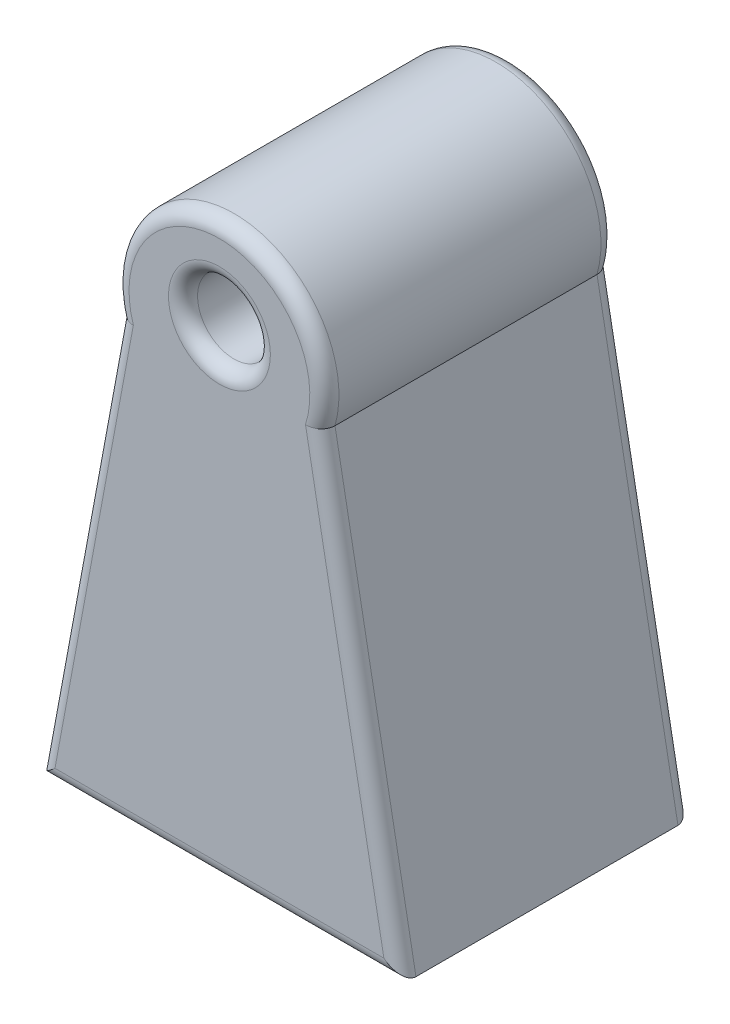
ISO-10303-21;
HEADER;
FILE_DESCRIPTION(('STEP AP214'),'2;1');
FILE_NAME('part.step','',(''),(''),'','','');
FILE_SCHEMA(('AUTOMOTIVE_DESIGN { 1 0 10303 214 1 1 1 1 }'));
ENDSEC;
DATA;
#1=APPLICATION_CONTEXT('core data for automotive mechanical design processes');
#2=APPLICATION_PROTOCOL_DEFINITION('international standard','automotive_design',2000,#1);
#3=PRODUCT_CONTEXT('',#1,'mechanical');
#4=PRODUCT('Part','Part','',(#3));
#5=PRODUCT_RELATED_PRODUCT_CATEGORY('part','',(#4));
#6=PRODUCT_DEFINITION_FORMATION('','',#4);
#7=PRODUCT_DEFINITION_CONTEXT('part definition',#1,'design');
#8=PRODUCT_DEFINITION('design','',#6,#7);
#9=PRODUCT_DEFINITION_SHAPE('','',#8);
#10=(LENGTH_UNIT() NAMED_UNIT(*) SI_UNIT(.MILLI.,.METRE.));
#11=(NAMED_UNIT(*) PLANE_ANGLE_UNIT() SI_UNIT($,.RADIAN.));
#12=(NAMED_UNIT(*) SI_UNIT($,.STERADIAN.) SOLID_ANGLE_UNIT());
#13=UNCERTAINTY_MEASURE_WITH_UNIT(LENGTH_MEASURE(1.E-05),#10,'distance_accuracy_value','');
#14=(GEOMETRIC_REPRESENTATION_CONTEXT(3) GLOBAL_UNCERTAINTY_ASSIGNED_CONTEXT((#13)) GLOBAL_UNIT_ASSIGNED_CONTEXT((#10,
#11,#12)) REPRESENTATION_CONTEXT('',''));
#15=CARTESIAN_POINT('',(0.,0.,0.));
#16=DIRECTION('',(0.,0.,1.));
#17=DIRECTION('',(1.,0.,0.));
#18=AXIS2_PLACEMENT_3D('',#15,#16,#17);
#19=CARTESIAN_POINT('',(0.,0.,200.));
#20=DIRECTION('',(0.,1.,0.));
#21=DIRECTION('',(0.,0.,1.));
#22=AXIS2_PLACEMENT_3D('',#19,#20,#21);
#23=PLANE('',#22);
#24=DIRECTION('',(1.,0.,0.));
#25=VECTOR('',#24,1.);
#26=CARTESIAN_POINT('',(0.,0.,10.));
#27=LINE('',#26,#25);
#28=CARTESIAN_POINT('',(0.,0.,10.));
#29=VERTEX_POINT('',#28);
#30=CARTESIAN_POINT('',(12.,0.,10.));
#31=VERTEX_POINT('',#30);
#32=EDGE_CURVE('E401',#29,#31,#27,.T.);
#33=ORIENTED_EDGE('',*,*,#32,.T.);
#34=DIRECTION('',(0.,0.,-1.));
#35=VECTOR('',#34,1.);
#36=CARTESIAN_POINT('',(12.,0.,10.));
#37=LINE('',#36,#35);
#38=CARTESIAN_POINT('',(12.,0.,190.));
#39=VERTEX_POINT('',#38);
#40=EDGE_CURVE('E48',#39,#31,#37,.T.);
#41=ORIENTED_EDGE('',*,*,#40,.F.);
#42=DIRECTION('',(1.,0.,0.));
#43=VECTOR('',#42,1.);
#44=CARTESIAN_POINT('',(0.,0.,190.));
#45=LINE('',#44,#43);
#46=CARTESIAN_POINT('',(0.,0.,190.));
#47=VERTEX_POINT('',#46);
#48=EDGE_CURVE('E343',#39,#47,#45,.F.);
#49=ORIENTED_EDGE('',*,*,#48,.T.);
#50=DIRECTION('',(0.,0.,-1.));
#51=VECTOR('',#50,1.);
#52=CARTESIAN_POINT('',(0.,0.,200.));
#53=LINE('',#52,#51);
#54=EDGE_CURVE('E438',#47,#29,#53,.T.);
#55=ORIENTED_EDGE('',*,*,#54,.T.);
#56=EDGE_LOOP('',(#33,#41,#49,#55));
#57=FACE_BOUND('',#56,.T.);
#58=ADVANCED_FACE('F31',(#57),#23,.F.);
#59=CARTESIAN_POINT('',(55.6017134794615,300.,200.));
#60=DIRECTION('',(0.983254907563954,-0.182235525492151,0.));
#61=DIRECTION('',(0.182235525492151,0.983254907563954,0.));
#62=AXIS2_PLACEMENT_3D('',#59,#60,#61);
#63=PLANE('',#62);
#64=DIRECTION('',(0.,0.,-1.));
#65=VECTOR('',#64,1.);
#66=CARTESIAN_POINT('',(55.6017134794615,300.,200.));
#67=LINE('',#66,#65);
#68=CARTESIAN_POINT('',(55.6017134794615,300.,190.));
#69=VERTEX_POINT('',#68);
#70=CARTESIAN_POINT('',(55.6017134794615,300.,10.));
#71=VERTEX_POINT('',#70);
#72=EDGE_CURVE('E436',#69,#71,#67,.T.);
#73=ORIENTED_EDGE('',*,*,#72,.T.);
#74=DIRECTION('',(-0.182235525492151,-0.983254907563954,0.));
#75=VECTOR('',#74,1.);
#76=CARTESIAN_POINT('',(55.6017134794615,300.,10.));
#77=LINE('',#76,#75);
#78=EDGE_CURVE('E250',#71,#29,#77,.T.);
#79=ORIENTED_EDGE('',*,*,#78,.T.);
#80=ORIENTED_EDGE('',*,*,#54,.F.);
#81=DIRECTION('',(-0.182235525492151,-0.983254907563954,0.));
#82=VECTOR('',#81,1.);
#83=CARTESIAN_POINT('',(55.6017134794615,300.,190.));
#84=LINE('',#83,#82);
#85=EDGE_CURVE('E342',#47,#69,#84,.F.);
#86=ORIENTED_EDGE('',*,*,#85,.T.);
#87=EDGE_LOOP('',(#73,#79,#80,#86));
#88=FACE_BOUND('',#87,.T.);
#89=ADVANCED_FACE('F314',(#88),#63,.F.);
#90=CARTESIAN_POINT('',(250.,0.,190.));
#91=VERTEX_POINT('',#90);
#92=CARTESIAN_POINT('',(238.,0.,190.));
#93=VERTEX_POINT('',#92);
#94=EDGE_CURVE('E335',#91,#93,#45,.F.);
#95=ORIENTED_EDGE('',*,*,#94,.T.);
#96=DIRECTION('',(0.,0.,1.));
#97=VECTOR('',#96,1.);
#98=CARTESIAN_POINT('',(238.,0.,10.));
#99=LINE('',#98,#97);
#100=CARTESIAN_POINT('',(238.,0.,10.));
#101=VERTEX_POINT('',#100);
#102=EDGE_CURVE('E187',#101,#93,#99,.T.);
#103=ORIENTED_EDGE('',*,*,#102,.F.);
#104=CARTESIAN_POINT('',(250.,0.,10.));
#105=VERTEX_POINT('',#104);
#106=EDGE_CURVE('E353',#101,#105,#27,.T.);
#107=ORIENTED_EDGE('',*,*,#106,.T.);
#108=DIRECTION('',(0.,0.,-1.));
#109=VECTOR('',#108,1.);
#110=CARTESIAN_POINT('',(250.,0.,200.));
#111=LINE('',#110,#109);
#112=EDGE_CURVE('E337',#91,#105,#111,.T.);
#113=ORIENTED_EDGE('',*,*,#112,.F.);
#114=EDGE_LOOP('',(#95,#103,#107,#113));
#115=FACE_BOUND('',#114,.T.);
#116=ADVANCED_FACE('F317',(#115),#23,.F.);
#117=CARTESIAN_POINT('',(250.,0.,200.));
#118=DIRECTION('',(-0.983254907563954,-0.182235525492151,0.));
#119=DIRECTION('',(0.182235525492151,-0.983254907563954,0.));
#120=AXIS2_PLACEMENT_3D('',#117,#118,#119);
#121=PLANE('',#120);
#122=ORIENTED_EDGE('',*,*,#112,.T.);
#123=DIRECTION('',(-0.182235525492151,0.983254907563954,0.));
#124=VECTOR('',#123,1.);
#125=CARTESIAN_POINT('',(250.,0.,10.));
#126=LINE('',#125,#124);
#127=CARTESIAN_POINT('',(194.398286520538,300.,10.));
#128=VERTEX_POINT('',#127);
#129=EDGE_CURVE('E92',#105,#128,#126,.T.);
#130=ORIENTED_EDGE('',*,*,#129,.T.);
#131=DIRECTION('',(0.,0.,-1.));
#132=VECTOR('',#131,1.);
#133=CARTESIAN_POINT('',(194.398286520538,300.,200.));
#134=LINE('',#133,#132);
#135=CARTESIAN_POINT('',(194.398286520538,300.,190.));
#136=VERTEX_POINT('',#135);
#137=EDGE_CURVE('E435',#136,#128,#134,.T.);
#138=ORIENTED_EDGE('',*,*,#137,.F.);
#139=DIRECTION('',(-0.182235525492151,0.983254907563954,0.));
#140=VECTOR('',#139,1.);
#141=CARTESIAN_POINT('',(250.,0.,190.));
#142=LINE('',#141,#140);
#143=EDGE_CURVE('E347',#136,#91,#142,.F.);
#144=ORIENTED_EDGE('',*,*,#143,.T.);
#145=EDGE_LOOP('',(#122,#130,#138,#144));
#146=FACE_BOUND('',#145,.T.);
#147=ADVANCED_FACE('F325',(#146),#121,.F.);
#148=CARTESIAN_POINT('',(125.,319.559208731359,200.));
#149=DIRECTION('',(0.,0.,-1.));
#150=DIRECTION('',(-1.,0.,0.));
#151=AXIS2_PLACEMENT_3D('',#148,#149,#150);
#152=CYLINDRICAL_SURFACE('',#151,72.1019057874592);
#153=ORIENTED_EDGE('',*,*,#137,.T.);
#154=CARTESIAN_POINT('',(125.,319.559208731359,10.));
#155=DIRECTION('',(0.,0.,1.));
#156=DIRECTION('',(1.,0.,0.));
#157=AXIS2_PLACEMENT_3D('',#154,#155,#156);
#158=CIRCLE('',#157,72.1019057874592);
#159=EDGE_CURVE('E84',#128,#71,#158,.T.);
#160=ORIENTED_EDGE('',*,*,#159,.T.);
#161=ORIENTED_EDGE('',*,*,#72,.F.);
#162=CARTESIAN_POINT('',(125.,319.559208731359,190.));
#163=DIRECTION('',(0.,0.,1.));
#164=DIRECTION('',(1.,0.,0.));
#165=AXIS2_PLACEMENT_3D('',#162,#163,#164);
#166=CIRCLE('',#165,72.1019057874592);
#167=EDGE_CURVE('E430',#69,#136,#166,.F.);
#168=ORIENTED_EDGE('',*,*,#167,.T.);
#169=EDGE_LOOP('',(#153,#160,#161,#168));
#170=FACE_BOUND('',#169,.T.);
#171=ADVANCED_FACE('F330',(#170),#152,.T.);
#172=CARTESIAN_POINT('',(125.,319.559208731359,200.));
#173=DIRECTION('',(0.,0.,1.));
#174=DIRECTION('',(1.,0.,0.));
#175=AXIS2_PLACEMENT_3D('',#172,#173,#174);
#176=PLANE('',#175);
#177=DIRECTION('',(-0.182235525492151,0.983254907563954,0.));
#178=VECTOR('',#177,1.);
#179=CARTESIAN_POINT('',(184.565737444899,298.177644745078,200.));
#180=LINE('',#179,#178);
#181=CARTESIAN_POINT('',(237.976306892572,10.,200.));
#182=VERTEX_POINT('',#181);
#183=CARTESIAN_POINT('',(184.124213962583,300.559892276781,200.));
#184=VERTEX_POINT('',#183);
#185=EDGE_CURVE('E450',#182,#184,#180,.T.);
#186=ORIENTED_EDGE('',*,*,#185,.T.);
#187=CARTESIAN_POINT('',(125.,319.559208731359,200.));
#188=DIRECTION('',(0.,0.,1.));
#189=DIRECTION('',(1.,0.,0.));
#190=AXIS2_PLACEMENT_3D('',#187,#188,#189);
#191=CIRCLE('',#190,62.1019057874592);
#192=CARTESIAN_POINT('',(65.8757860374174,300.559892276781,200.));
#193=VERTEX_POINT('',#192);
#194=EDGE_CURVE('E433',#184,#193,#191,.T.);
#195=ORIENTED_EDGE('',*,*,#194,.T.);
#196=DIRECTION('',(-0.182235525492151,-0.983254907563954,0.));
#197=VECTOR('',#196,1.);
#198=CARTESIAN_POINT('',(9.83254907563953,-1.82235525492153,200.));
#199=LINE('',#198,#197);
#200=CARTESIAN_POINT('',(12.023693107428,10.,200.));
#201=VERTEX_POINT('',#200);
#202=EDGE_CURVE('E446',#193,#201,#199,.T.);
#203=ORIENTED_EDGE('',*,*,#202,.T.);
#204=DIRECTION('',(1.,0.,0.));
#205=VECTOR('',#204,1.);
#206=CARTESIAN_POINT('',(250.,10.,200.));
#207=LINE('',#206,#205);
#208=EDGE_CURVE('E448',#201,#182,#207,.T.);
#209=ORIENTED_EDGE('',*,*,#208,.T.);
#210=EDGE_LOOP('',(#186,#195,#203,#209));
#211=FACE_BOUND('',#210,.T.);
#212=CARTESIAN_POINT('',(125.,330.,200.));
#213=DIRECTION('',(0.,0.,1.));
#214=DIRECTION('',(1.,0.,0.));
#215=AXIS2_PLACEMENT_3D('',#212,#213,#214);
#216=CIRCLE('',#215,35.);
#217=CARTESIAN_POINT('',(160.,330.,200.));
#218=VERTEX_POINT('',#217);
#219=EDGE_CURVE('E443',#218,#218,#216,.F.);
#220=ORIENTED_EDGE('',*,*,#219,.T.);
#221=EDGE_LOOP('',(#220));
#222=FACE_BOUND('',#221,.T.);
#223=ADVANCED_FACE('F453',(#211,#222),#176,.T.);
#224=CARTESIAN_POINT('',(125.,319.559208731359,0.));
#225=DIRECTION('',(0.,0.,1.));
#226=DIRECTION('',(1.,0.,0.));
#227=AXIS2_PLACEMENT_3D('',#224,#225,#226);
#228=PLANE('',#227);
#229=DIRECTION('',(-0.182235525492151,0.983254907563954,0.));
#230=VECTOR('',#229,1.);
#231=CARTESIAN_POINT('',(178.756338384746,329.522357146605,0.));
#232=LINE('',#231,#230);
#233=CARTESIAN_POINT('',(184.124213962583,300.559892276781,0.));
#234=VERTEX_POINT('',#233);
#235=CARTESIAN_POINT('',(237.976306892572,10.,0.));
#236=VERTEX_POINT('',#235);
#237=EDGE_CURVE('E411',#234,#236,#232,.F.);
#238=ORIENTED_EDGE('',*,*,#237,.T.);
#239=DIRECTION('',(1.,0.,0.));
#240=VECTOR('',#239,1.);
#241=CARTESIAN_POINT('',(125.,10.,0.));
#242=LINE('',#241,#240);
#243=CARTESIAN_POINT('',(12.0236931074281,10.,0.));
#244=VERTEX_POINT('',#243);
#245=EDGE_CURVE('E399',#236,#244,#242,.F.);
#246=ORIENTED_EDGE('',*,*,#245,.T.);
#247=DIRECTION('',(-0.182235525492151,-0.983254907563954,0.));
#248=VECTOR('',#247,1.);
#249=CARTESIAN_POINT('',(71.2436616152537,329.522357146605,0.));
#250=LINE('',#249,#248);
#251=CARTESIAN_POINT('',(65.8757860374174,300.559892276781,0.));
#252=VERTEX_POINT('',#251);
#253=EDGE_CURVE('E403',#244,#252,#250,.F.);
#254=ORIENTED_EDGE('',*,*,#253,.T.);
#255=CARTESIAN_POINT('',(125.,319.559208731359,0.));
#256=DIRECTION('',(0.,0.,1.));
#257=DIRECTION('',(1.,0.,0.));
#258=AXIS2_PLACEMENT_3D('',#255,#256,#257);
#259=CIRCLE('',#258,62.1019057874592);
#260=EDGE_CURVE('E407',#252,#234,#259,.F.);
#261=ORIENTED_EDGE('',*,*,#260,.T.);
#262=EDGE_LOOP('',(#238,#246,#254,#261));
#263=FACE_BOUND('',#262,.T.);
#264=ADVANCED_FACE('F409',(#263),#228,.F.);
#265=CARTESIAN_POINT('',(125.,330.,50.));
#266=DIRECTION('',(0.,0.,1.));
#267=DIRECTION('',(1.,0.,0.));
#268=AXIS2_PLACEMENT_3D('',#265,#266,#267);
#269=CYLINDRICAL_SURFACE('',#268,25.);
#270=CARTESIAN_POINT('',(125.,330.,190.));
#271=DIRECTION('',(0.,0.,1.));
#272=DIRECTION('',(1.,0.,0.));
#273=AXIS2_PLACEMENT_3D('',#270,#271,#272);
#274=CIRCLE('',#273,25.);
#275=CARTESIAN_POINT('',(150.,330.,190.));
#276=VERTEX_POINT('',#275);
#277=EDGE_CURVE('E345',#276,#276,#274,.T.);
#278=ORIENTED_EDGE('',*,*,#277,.T.);
#279=EDGE_LOOP('',(#278));
#280=FACE_BOUND('',#279,.T.);
#281=CARTESIAN_POINT('',(125.,330.,50.));
#282=DIRECTION('',(0.,0.,1.));
#283=DIRECTION('',(1.,0.,0.));
#284=AXIS2_PLACEMENT_3D('',#281,#282,#283);
#285=CIRCLE('',#284,25.);
#286=CARTESIAN_POINT('',(150.,330.,50.));
#287=VERTEX_POINT('',#286);
#288=EDGE_CURVE('E418',#287,#287,#285,.T.);
#289=ORIENTED_EDGE('',*,*,#288,.F.);
#290=EDGE_LOOP('',(#289));
#291=FACE_BOUND('',#290,.T.);
#292=ADVANCED_FACE('F475',(#280,#291),#269,.F.);
#293=CARTESIAN_POINT('',(125.,330.,50.));
#294=DIRECTION('',(0.,0.,1.));
#295=DIRECTION('',(1.,0.,0.));
#296=AXIS2_PLACEMENT_3D('',#293,#294,#295);
#297=PLANE('',#296);
#298=ORIENTED_EDGE('',*,*,#288,.T.);
#299=EDGE_LOOP('',(#298));
#300=FACE_BOUND('',#299,.T.);
#301=ADVANCED_FACE('F382',(#300),#297,.T.);
#302=CARTESIAN_POINT('',(125.,10.,190.));
#303=DIRECTION('',(-1.,0.,0.));
#304=DIRECTION('',(0.,0.,1.));
#305=AXIS2_PLACEMENT_3D('',#302,#303,#304);
#306=CYLINDRICAL_SURFACE('',#305,10.);
#307=CARTESIAN_POINT('',(12.023693107428,9.99999999999998,190.));
#308=DIRECTION('',(-0.639439001980583,0.768841832073461,0.));
#309=DIRECTION('',(0.768841832073461,0.639439001980583,0.));
#310=AXIS2_PLACEMENT_3D('',#307,#308,#309);
#311=ELLIPSE('',#310,15.6387082568099,10.);
#312=EDGE_CURVE('E419',#47,#201,#311,.T.);
#313=ORIENTED_EDGE('',*,*,#312,.F.);
#314=ORIENTED_EDGE('',*,*,#48,.F.);
#315=DIRECTION('',(-1.,0.,0.));
#316=VECTOR('',#315,1.);
#317=CARTESIAN_POINT('',(12.,0.,190.));
#318=LINE('',#317,#316);
#319=EDGE_CURVE('E183',#93,#39,#318,.T.);
#320=ORIENTED_EDGE('',*,*,#319,.F.);
#321=ORIENTED_EDGE('',*,*,#94,.F.);
#322=CARTESIAN_POINT('',(237.976306892572,9.99999999999998,190.));
#323=DIRECTION('',(-0.639439001980583,-0.768841832073461,0.));
#324=DIRECTION('',(-0.768841832073461,0.639439001980583,0.));
#325=AXIS2_PLACEMENT_3D('',#322,#323,#324);
#326=ELLIPSE('',#325,15.6387082568099,10.);
#327=EDGE_CURVE('E417',#182,#91,#326,.F.);
#328=ORIENTED_EDGE('',*,*,#327,.F.);
#329=ORIENTED_EDGE('',*,*,#208,.F.);
#330=EDGE_LOOP('',(#313,#314,#320,#321,#328,#329));
#331=FACE_BOUND('',#330,.T.);
#332=ADVANCED_FACE('F378',(#331),#306,.T.);
#333=CARTESIAN_POINT('',(178.756338384746,329.522357146605,190.));
#334=DIRECTION('',(0.182235525492151,-0.983254907563954,0.));
#335=DIRECTION('',(0.983254907563954,0.182235525492151,0.));
#336=AXIS2_PLACEMENT_3D('',#333,#334,#335);
#337=CYLINDRICAL_SURFACE('',#336,10.);
#338=ORIENTED_EDGE('',*,*,#327,.T.);
#339=ORIENTED_EDGE('',*,*,#143,.F.);
#340=CARTESIAN_POINT('',(194.398286520538,300.,190.));
#341=CARTESIAN_POINT('',(194.39832100178,299.9999997967,190.275818358929));
#342=CARTESIAN_POINT('',(194.386583039943,300.000535584638,190.551629867842));
#343=CARTESIAN_POINT('',(194.339812769987,300.002677609814,191.101240714431));
#344=CARTESIAN_POINT('',(194.304782720362,300.004283743267,191.375040244594));
#345=CARTESIAN_POINT('',(194.211743364791,300.008561954498,191.918305469971));
#346=CARTESIAN_POINT('',(194.15376603429,300.011232549059,192.187776655036));
#347=CARTESIAN_POINT('',(194.015315463559,300.017636695525,192.720860660791));
#348=CARTESIAN_POINT('',(193.934842287859,300.02137024438,192.984473498284));
#349=CARTESIAN_POINT('',(193.75202786298,300.029896785035,193.5040457174));
#350=CARTESIAN_POINT('',(193.649682059873,300.034689997465,193.760003492553));
#351=CARTESIAN_POINT('',(193.42394585275,300.045329307562,194.262447225166));
#352=CARTESIAN_POINT('',(193.300554839018,300.051175435734,194.508932907951));
#353=CARTESIAN_POINT('',(193.033706449713,300.063911611919,194.990739308998));
#354=CARTESIAN_POINT('',(192.890250342868,300.070801593931,195.226060731926));
#355=CARTESIAN_POINT('',(192.584370754676,300.085614564726,195.683996746217));
#356=CARTESIAN_POINT('',(192.421947198155,300.093537557603,195.906611287212));
#357=CARTESIAN_POINT('',(192.077544552604,300.110491438624,196.339976929005));
#358=CARTESIAN_POINT('',(191.895376826793,300.119533156784,196.550577677819));
#359=CARTESIAN_POINT('',(191.514233042497,300.138641188168,196.956047672319));
#360=CARTESIAN_POINT('',(191.315251563426,300.148707832035,197.150911804777));
#361=CARTESIAN_POINT('',(190.901972026953,300.169841162561,197.523641756919));
#362=CARTESIAN_POINT('',(190.687672254695,300.180907961223,197.701505668237));
#363=CARTESIAN_POINT('',(190.245312317406,300.204012236786,198.039141627408));
#364=CARTESIAN_POINT('',(190.017251759774,300.216049741386,198.198913158703));
#365=CARTESIAN_POINT('',(189.543083914974,300.241375359641,198.503206743178));
#366=CARTESIAN_POINT('',(189.29666714256,300.254687298727,198.647244696123));
#367=CARTESIAN_POINT('',(188.79291051499,300.282246145816,198.914428651428));
#368=CARTESIAN_POINT('',(188.5355739735,300.29649277089,199.03758093578));
#369=CARTESIAN_POINT('',(188.011715441847,300.325872385721,199.262343210769));
#370=CARTESIAN_POINT('',(187.74519379213,300.341005342642,199.363953998844));
#371=CARTESIAN_POINT('',(187.204878062979,300.372091615804,199.54505755481));
#372=CARTESIAN_POINT('',(186.931085508622,300.388044760659,199.624554921484));
#373=CARTESIAN_POINT('',(186.245358020234,300.42853863347,199.793766888441));
#374=CARTESIAN_POINT('',(185.830095161428,300.453531265751,199.870123354431));
#375=CARTESIAN_POINT('',(184.994158622629,300.50486313156,199.972597680595));
#376=CARTESIAN_POINT('',(184.57349653629,300.531199754732,199.998809386951));
#377=CARTESIAN_POINT('',(184.143534416803,300.558657614921,199.99998681025));
#378=CARTESIAN_POINT('',(184.133874073543,300.559274813796,200.000000025418));
#379=CARTESIAN_POINT('',(184.124213962583,300.559892276781,200.));
#380=B_SPLINE_CURVE_WITH_KNOTS('',3,(#340,#341,#342,#343,#344,#345,#346,#347,#348,#349,#350,
#351,#352,#353,#354,#355,#356,#357,#358,#359,#360,#361,#362,#363,#364,#365,#366,#367,#368,#369,
#370,#371,#372,#373,#374,#375,#376,#377,#378,#379),.UNSPECIFIED.,.F.,.F.,(4,2,2,2,2,2,2,2,2,2,2,
2,2,2,2,2,2,2,2,4),(0.,0.827194766468748,1.65430933654282,2.48027541461702,3.30623912336832,
4.13237496740268,4.95853475009761,5.78464231775733,6.61075315973487,7.4456001727352,
8.28071736644054,9.11592819680321,9.95116286738728,10.8073863547854,11.6633518487568,
12.5192856504184,13.3750413158557,14.6408626754043,15.9043127171581,15.9333528210611),.UNSPECIFIED.);
#381=EDGE_CURVE('E361',#184,#136,#380,.F.);
#382=ORIENTED_EDGE('',*,*,#381,.F.);
#383=ORIENTED_EDGE('',*,*,#185,.F.);
#384=EDGE_LOOP('',(#338,#339,#382,#383));
#385=FACE_BOUND('',#384,.T.);
#386=ADVANCED_FACE('F373',(#385),#337,.T.);
#387=CARTESIAN_POINT('',(71.2436616152537,329.522357146605,190.));
#388=DIRECTION('',(0.182235525492151,0.983254907563954,0.));
#389=DIRECTION('',(-0.983254907563954,0.182235525492151,0.));
#390=AXIS2_PLACEMENT_3D('',#387,#388,#389);
#391=CYLINDRICAL_SURFACE('',#390,10.);
#392=ORIENTED_EDGE('',*,*,#312,.T.);
#393=ORIENTED_EDGE('',*,*,#202,.F.);
#394=CARTESIAN_POINT('',(55.6017134794615,300.,190.));
#395=CARTESIAN_POINT('',(55.60167899822,299.9999997967,190.275818358929));
#396=CARTESIAN_POINT('',(55.613416960057,300.000535584638,190.551629867842));
#397=CARTESIAN_POINT('',(55.6601872300127,300.002677609814,191.101240714431));
#398=CARTESIAN_POINT('',(55.6952172796381,300.004283743267,191.375040244594));
#399=CARTESIAN_POINT('',(55.7882566352088,300.008561954498,191.918305469971));
#400=CARTESIAN_POINT('',(55.8462339657096,300.011232549059,192.187776655036));
#401=CARTESIAN_POINT('',(55.9846845364413,300.017636695525,192.720860660791));
#402=CARTESIAN_POINT('',(56.065157712141,300.02137024438,192.984473498284));
#403=CARTESIAN_POINT('',(56.2479721370195,300.029896785035,193.5040457174));
#404=CARTESIAN_POINT('',(56.3503179401273,300.034689997465,193.760003492553));
#405=CARTESIAN_POINT('',(56.5760541472501,300.045329307562,194.262447225166));
#406=CARTESIAN_POINT('',(56.6994451609815,300.051175435734,194.508932907951));
#407=CARTESIAN_POINT('',(56.9662935502872,300.063911611919,194.990739308998));
#408=CARTESIAN_POINT('',(57.1097496571323,300.070801593931,195.226060731926));
#409=CARTESIAN_POINT('',(57.4156292453235,300.085614564726,195.683996746217));
#410=CARTESIAN_POINT('',(57.5780528018454,300.093537557603,195.906611287212));
#411=CARTESIAN_POINT('',(57.922455447396,300.110491438624,196.339976929005));
#412=CARTESIAN_POINT('',(58.1046231732067,300.119533156784,196.550577677819));
#413=CARTESIAN_POINT('',(58.4857669575032,300.138641188168,196.956047672319));
#414=CARTESIAN_POINT('',(58.6847484365735,300.148707832035,197.150911804777));
#415=CARTESIAN_POINT('',(59.0980279730474,300.169841162561,197.523641756919));
#416=CARTESIAN_POINT('',(59.312327745305,300.180907961223,197.701505668237));
#417=CARTESIAN_POINT('',(59.7546876825938,300.204012236786,198.039141627408));
#418=CARTESIAN_POINT('',(59.9827482402265,300.216049741386,198.198913158703));
#419=CARTESIAN_POINT('',(60.456916085026,300.241375359641,198.503206743178));
#420=CARTESIAN_POINT('',(60.7033328574396,300.254687298727,198.647244696123));
#421=CARTESIAN_POINT('',(61.2070894850099,300.282246145816,198.914428651428));
#422=CARTESIAN_POINT('',(61.4644260264999,300.29649277089,199.03758093578));
#423=CARTESIAN_POINT('',(61.9882845581532,300.325872385722,199.262343210769));
#424=CARTESIAN_POINT('',(62.2548062078704,300.341005342642,199.363953998844));
#425=CARTESIAN_POINT('',(62.7951219370209,300.372091615804,199.54505755481));
#426=CARTESIAN_POINT('',(63.0689144913782,300.388044760659,199.624554921484));
#427=CARTESIAN_POINT('',(63.7546419797661,300.42853863347,199.793766888441));
#428=CARTESIAN_POINT('',(64.1699048385722,300.453531265751,199.870123354431));
#429=CARTESIAN_POINT('',(65.0058413773714,300.504863131559,199.972597680595));
#430=CARTESIAN_POINT('',(65.42650346371,300.53119975473,199.998809386951));
#431=CARTESIAN_POINT('',(65.856465583197,300.558657614921,199.99998681025));
#432=CARTESIAN_POINT('',(65.8661259264565,300.559274813796,200.000000025418));
#433=CARTESIAN_POINT('',(65.8757860374173,300.559892276781,200.));
#434=B_SPLINE_CURVE_WITH_KNOTS('',3,(#394,#395,#396,#397,#398,#399,#400,#401,#402,#403,#404,
#405,#406,#407,#408,#409,#410,#411,#412,#413,#414,#415,#416,#417,#418,#419,#420,#421,#422,#423,
#424,#425,#426,#427,#428,#429,#430,#431,#432,#433),.UNSPECIFIED.,.F.,.F.,(4,2,2,2,2,2,2,2,2,2,2,
2,2,2,2,2,2,2,2,4),(0.,0.827194766468721,1.65430933654282,2.48027541461705,3.30623912336831,
4.13237496740268,4.95853475009762,5.7846423177573,6.61075315973487,7.44560017273516,
8.28071736644054,9.11592819680321,9.95116286738728,10.8073863547854,11.6633518487568,
12.5192856504183,13.3750413158557,14.6408626754043,15.9043127171581,15.9333528210611),.UNSPECIFIED.);
#435=EDGE_CURVE('E354',#69,#193,#434,.T.);
#436=ORIENTED_EDGE('',*,*,#435,.F.);
#437=ORIENTED_EDGE('',*,*,#85,.F.);
#438=EDGE_LOOP('',(#392,#393,#436,#437));
#439=FACE_BOUND('',#438,.T.);
#440=ADVANCED_FACE('F367',(#439),#391,.T.);
#441=CARTESIAN_POINT('',(125.,319.559208731359,190.));
#442=DIRECTION('',(0.,0.,1.));
#443=DIRECTION('',(1.,0.,0.));
#444=AXIS2_PLACEMENT_3D('',#441,#442,#443);
#445=TOROIDAL_SURFACE('',#444,62.1019057874592,10.);
#446=ORIENTED_EDGE('',*,*,#381,.T.);
#447=ORIENTED_EDGE('',*,*,#167,.F.);
#448=ORIENTED_EDGE('',*,*,#435,.T.);
#449=ORIENTED_EDGE('',*,*,#194,.F.);
#450=EDGE_LOOP('',(#446,#447,#448,#449));
#451=FACE_BOUND('',#450,.T.);
#452=ADVANCED_FACE('F369',(#451),#445,.T.);
#453=CARTESIAN_POINT('',(125.,330.,190.));
#454=DIRECTION('',(0.,0.,1.));
#455=DIRECTION('',(1.,0.,0.));
#456=AXIS2_PLACEMENT_3D('',#453,#454,#455);
#457=TOROIDAL_SURFACE('',#456,35.,10.);
#458=ORIENTED_EDGE('',*,*,#219,.F.);
#459=EDGE_LOOP('',(#458));
#460=FACE_BOUND('',#459,.T.);
#461=ORIENTED_EDGE('',*,*,#277,.F.);
#462=EDGE_LOOP('',(#461));
#463=FACE_BOUND('',#462,.T.);
#464=ADVANCED_FACE('F285',(#460,#463),#457,.T.);
#465=CARTESIAN_POINT('',(125.,319.559208731359,10.));
#466=DIRECTION('',(0.,0.,1.));
#467=DIRECTION('',(1.,0.,0.));
#468=AXIS2_PLACEMENT_3D('',#465,#466,#467);
#469=TOROIDAL_SURFACE('',#468,62.1019057874592,10.);
#470=CARTESIAN_POINT('',(194.398286520538,300.,10.));
#471=CARTESIAN_POINT('',(194.39832100178,299.9999997967,9.72418164107128));
#472=CARTESIAN_POINT('',(194.386583039943,300.000535584638,9.44837013215759));
#473=CARTESIAN_POINT('',(194.339812769987,300.002677609814,8.89875928556854));
#474=CARTESIAN_POINT('',(194.304782720362,300.004283743267,8.62495975540595));
#475=CARTESIAN_POINT('',(194.211743364791,300.008561954498,8.08169453002883));
#476=CARTESIAN_POINT('',(194.15376603429,300.011232549059,7.81222334496383));
#477=CARTESIAN_POINT('',(194.015315463559,300.017636695525,7.27913933920886));
#478=CARTESIAN_POINT('',(193.934842287859,300.02137024438,7.0155265017161));
#479=CARTESIAN_POINT('',(193.75202786298,300.029896785035,6.49595428259987));
#480=CARTESIAN_POINT('',(193.649682059873,300.034689997465,6.23999650744724));
#481=CARTESIAN_POINT('',(193.42394585275,300.045329307562,5.73755277483371));
#482=CARTESIAN_POINT('',(193.300554839018,300.051175435734,5.4910670920494));
#483=CARTESIAN_POINT('',(193.033706449713,300.063911611919,5.00926069100201));
#484=CARTESIAN_POINT('',(192.890250342868,300.070801593931,4.77393926807429));
#485=CARTESIAN_POINT('',(192.584370754676,300.085614564726,4.31600325378338));
#486=CARTESIAN_POINT('',(192.421947198155,300.093537557603,4.09338871278804));
#487=CARTESIAN_POINT('',(192.077544552604,300.110491438624,3.66002307099496));
#488=CARTESIAN_POINT('',(191.895376826793,300.119533156784,3.44942232218086));
#489=CARTESIAN_POINT('',(191.514233042497,300.138641188168,3.04395232768105));
#490=CARTESIAN_POINT('',(191.315251563426,300.148707832035,2.84908819522342));
#491=CARTESIAN_POINT('',(190.901972026953,300.169841162561,2.47635824308056));
#492=CARTESIAN_POINT('',(190.687672254695,300.180907961223,2.29849433176347));
#493=CARTESIAN_POINT('',(190.245312317406,300.204012236786,1.96085837259246));
#494=CARTESIAN_POINT('',(190.017251759774,300.216049741386,1.80108684129681));
#495=CARTESIAN_POINT('',(189.543083914974,300.241375359641,1.49679325682152));
#496=CARTESIAN_POINT('',(189.29666714256,300.254687298727,1.35275530387712));
#497=CARTESIAN_POINT('',(188.79291051499,300.282246145816,1.08557134857204));
#498=CARTESIAN_POINT('',(188.5355739735,300.29649277089,0.962419064219727));
#499=CARTESIAN_POINT('',(188.011715441847,300.325872385722,0.737656789231282));
#500=CARTESIAN_POINT('',(187.74519379213,300.341005342642,0.636046001155832));
#501=CARTESIAN_POINT('',(187.204878062979,300.372091615804,0.454942445189685));
#502=CARTESIAN_POINT('',(186.931085508622,300.388044760659,0.375445078516322));
#503=CARTESIAN_POINT('',(186.245358020234,300.42853863347,0.206233111558543));
#504=CARTESIAN_POINT('',(185.830095161428,300.453531265752,0.129876645568645));
#505=CARTESIAN_POINT('',(184.994158622629,300.504863131559,0.0274023194049993));
#506=CARTESIAN_POINT('',(184.57349653629,300.531199754728,0.00119061304880663));
#507=CARTESIAN_POINT('',(184.143534416803,300.558657614921,1.3189750451352E-05));
#508=CARTESIAN_POINT('',(184.133874073543,300.559274813796,-2.54180115660447E-08));
#509=CARTESIAN_POINT('',(184.124213962583,300.559892276781,0.));
#510=B_SPLINE_CURVE_WITH_KNOTS('',3,(#470,#471,#472,#473,#474,#475,#476,#477,#478,#479,#480,
#481,#482,#483,#484,#485,#486,#487,#488,#489,#490,#491,#492,#493,#494,#495,#496,#497,#498,#499,
#500,#501,#502,#503,#504,#505,#506,#507,#508,#509),.UNSPECIFIED.,.F.,.F.,(4,2,2,2,2,2,2,2,2,2,2,
2,2,2,2,2,2,2,2,4),(0.,0.827194766468751,1.65430933654284,2.48027541461706,3.30623912336832,
4.13237496740271,4.95853475009766,5.78464231775732,6.61075315973488,7.44560017273519,
8.28071736644059,9.11592819680327,9.95116286738731,10.8073863547854,11.6633518487568,
12.5192856504183,13.3750413158557,14.6408626754044,15.9043127171581,15.9333528210611),.UNSPECIFIED.);
#511=EDGE_CURVE('E265',#234,#128,#510,.F.);
#512=ORIENTED_EDGE('',*,*,#511,.F.);
#513=ORIENTED_EDGE('',*,*,#260,.F.);
#514=CARTESIAN_POINT('',(55.6017134794615,300.,10.));
#515=CARTESIAN_POINT('',(55.60167899822,299.9999997967,9.72418164107128));
#516=CARTESIAN_POINT('',(55.613416960057,300.000535584638,9.44837013215759));
#517=CARTESIAN_POINT('',(55.6601872300127,300.002677609814,8.89875928556854));
#518=CARTESIAN_POINT('',(55.6952172796381,300.004283743267,8.62495975540595));
#519=CARTESIAN_POINT('',(55.7882566352088,300.008561954498,8.08169453002883));
#520=CARTESIAN_POINT('',(55.8462339657096,300.011232549059,7.81222334496383));
#521=CARTESIAN_POINT('',(55.9846845364413,300.017636695525,7.27913933920886));
#522=CARTESIAN_POINT('',(56.065157712141,300.02137024438,7.0155265017161));
#523=CARTESIAN_POINT('',(56.2479721370195,300.029896785035,6.49595428259988));
#524=CARTESIAN_POINT('',(56.3503179401274,300.034689997465,6.23999650744726));
#525=CARTESIAN_POINT('',(56.5760541472502,300.045329307562,5.73755277483374));
#526=CARTESIAN_POINT('',(56.6994451609815,300.051175435734,5.49106709204942));
#527=CARTESIAN_POINT('',(56.9662935502872,300.063911611919,5.00926069100202));
#528=CARTESIAN_POINT('',(57.1097496571323,300.070801593931,4.7739392680743));
#529=CARTESIAN_POINT('',(57.4156292453235,300.085614564726,4.31600325378339));
#530=CARTESIAN_POINT('',(57.5780528018455,300.093537557603,4.09338871278805));
#531=CARTESIAN_POINT('',(57.922455447396,300.110491438624,3.66002307099496));
#532=CARTESIAN_POINT('',(58.1046231732067,300.119533156784,3.44942232218085));
#533=CARTESIAN_POINT('',(58.4857669575033,300.138641188168,3.04395232768105));
#534=CARTESIAN_POINT('',(58.6847484365736,300.148707832035,2.84908819522343));
#535=CARTESIAN_POINT('',(59.0980279730475,300.169841162561,2.47635824308057));
#536=CARTESIAN_POINT('',(59.312327745305,300.180907961223,2.29849433176348));
#537=CARTESIAN_POINT('',(59.7546876825938,300.204012236786,1.96085837259247));
#538=CARTESIAN_POINT('',(59.9827482402265,300.216049741386,1.80108684129682));
#539=CARTESIAN_POINT('',(60.4569160850261,300.241375359641,1.49679325682153));
#540=CARTESIAN_POINT('',(60.7033328574396,300.254687298727,1.35275530387713));
#541=CARTESIAN_POINT('',(61.2070894850099,300.282246145816,1.08557134857205));
#542=CARTESIAN_POINT('',(61.4644260264999,300.29649277089,0.96241906421974));
#543=CARTESIAN_POINT('',(61.9882845581532,300.325872385722,0.737656789231294));
#544=CARTESIAN_POINT('',(62.2548062078704,300.341005342642,0.636046001155846));
#545=CARTESIAN_POINT('',(62.7951219370209,300.372091615804,0.454942445189694));
#546=CARTESIAN_POINT('',(63.0689144913783,300.388044760658,0.375445078516324));
#547=CARTESIAN_POINT('',(63.7546419797661,300.428538633472,0.206233111558537));
#548=CARTESIAN_POINT('',(64.1699048385719,300.453531265757,0.129876645568642));
#549=CARTESIAN_POINT('',(65.0058413773718,300.504863131554,0.0274023194049907));
#550=CARTESIAN_POINT('',(65.4265034637114,300.53119975471,0.00119061304878678));
#551=CARTESIAN_POINT('',(65.8564655831971,300.55865761492,1.31897504504316E-05));
#552=CARTESIAN_POINT('',(65.8661259264566,300.559274813795,-2.54180120449282E-08));
#553=CARTESIAN_POINT('',(65.8757860374174,300.559892276781,0.));
#554=B_SPLINE_CURVE_WITH_KNOTS('',3,(#514,#515,#516,#517,#518,#519,#520,#521,#522,#523,#524,
#525,#526,#527,#528,#529,#530,#531,#532,#533,#534,#535,#536,#537,#538,#539,#540,#541,#542,#543,
#544,#545,#546,#547,#548,#549,#550,#551,#552,#553),.UNSPECIFIED.,.F.,.F.,(4,2,2,2,2,2,2,2,2,2,2,
2,2,2,2,2,2,2,2,4),(0.,0.827194766468752,1.65430933654284,2.48027541461706,3.30623912336832,
4.13237496740269,4.95853475009763,5.78464231775732,6.61075315973488,7.44560017273519,
8.28071736644061,9.11592819680325,9.9511628673873,10.8073863547854,11.6633518487567,
12.5192856504183,13.3750413158557,14.6408626754044,15.9043127171581,15.9333528210611),.UNSPECIFIED.);
#555=EDGE_CURVE('E273',#71,#252,#554,.T.);
#556=ORIENTED_EDGE('',*,*,#555,.F.);
#557=ORIENTED_EDGE('',*,*,#159,.F.);
#558=EDGE_LOOP('',(#512,#513,#556,#557));
#559=FACE_BOUND('',#558,.T.);
#560=ADVANCED_FACE('F281',(#559),#469,.T.);
#561=CARTESIAN_POINT('',(65.434262555101,298.177644745078,10.));
#562=DIRECTION('',(-0.182235525492151,-0.983254907563954,0.));
#563=DIRECTION('',(0.983254907563954,-0.182235525492151,0.));
#564=AXIS2_PLACEMENT_3D('',#561,#562,#563);
#565=CYLINDRICAL_SURFACE('',#564,10.);
#566=ORIENTED_EDGE('',*,*,#555,.T.);
#567=ORIENTED_EDGE('',*,*,#253,.F.);
#568=CARTESIAN_POINT('',(12.0236931074281,9.99999999999998,10.));
#569=DIRECTION('',(0.639439001980583,-0.768841832073461,0.));
#570=DIRECTION('',(-0.768841832073461,-0.639439001980583,0.));
#571=AXIS2_PLACEMENT_3D('',#568,#569,#570);
#572=ELLIPSE('',#571,15.6387082568099,10.);
#573=EDGE_CURVE('E263',#29,#244,#572,.T.);
#574=ORIENTED_EDGE('',*,*,#573,.F.);
#575=ORIENTED_EDGE('',*,*,#78,.F.);
#576=EDGE_LOOP('',(#566,#567,#574,#575));
#577=FACE_BOUND('',#576,.T.);
#578=ADVANCED_FACE('F284',(#577),#565,.T.);
#579=CARTESIAN_POINT('',(240.16745092436,-1.82235525492151,10.));
#580=DIRECTION('',(-0.182235525492151,0.983254907563954,0.));
#581=DIRECTION('',(-0.983254907563954,-0.182235525492151,0.));
#582=AXIS2_PLACEMENT_3D('',#579,#580,#581);
#583=CYLINDRICAL_SURFACE('',#582,10.);
#584=ORIENTED_EDGE('',*,*,#511,.T.);
#585=ORIENTED_EDGE('',*,*,#129,.F.);
#586=CARTESIAN_POINT('',(237.976306892572,10.,10.));
#587=DIRECTION('',(0.639439001980583,0.768841832073461,0.));
#588=DIRECTION('',(-0.768841832073461,0.639439001980583,0.));
#589=AXIS2_PLACEMENT_3D('',#586,#587,#588);
#590=ELLIPSE('',#589,15.6387082568099,10.);
#591=EDGE_CURVE('E200',#236,#105,#590,.F.);
#592=ORIENTED_EDGE('',*,*,#591,.F.);
#593=ORIENTED_EDGE('',*,*,#237,.F.);
#594=EDGE_LOOP('',(#584,#585,#592,#593));
#595=FACE_BOUND('',#594,.T.);
#596=ADVANCED_FACE('F278',(#595),#583,.T.);
#597=CARTESIAN_POINT('',(0.,10.,10.));
#598=DIRECTION('',(1.,0.,0.));
#599=DIRECTION('',(0.,0.,-1.));
#600=AXIS2_PLACEMENT_3D('',#597,#598,#599);
#601=CYLINDRICAL_SURFACE('',#600,10.);
#602=ORIENTED_EDGE('',*,*,#573,.T.);
#603=ORIENTED_EDGE('',*,*,#245,.F.);
#604=ORIENTED_EDGE('',*,*,#591,.T.);
#605=ORIENTED_EDGE('',*,*,#106,.F.);
#606=DIRECTION('',(1.,0.,0.));
#607=VECTOR('',#606,1.);
#608=CARTESIAN_POINT('',(12.,0.,10.));
#609=LINE('',#608,#607);
#610=EDGE_CURVE('E204',#31,#101,#609,.T.);
#611=ORIENTED_EDGE('',*,*,#610,.F.);
#612=ORIENTED_EDGE('',*,*,#32,.F.);
#613=EDGE_LOOP('',(#602,#603,#604,#605,#611,#612));
#614=FACE_BOUND('',#613,.T.);
#615=ADVANCED_FACE('F385',(#614),#601,.T.);
#616=CARTESIAN_POINT('',(12.,10.,190.));
#617=DIRECTION('',(0.,1.,0.));
#618=DIRECTION('',(0.,0.,1.));
#619=AXIS2_PLACEMENT_3D('',#616,#617,#618);
#620=PLANE('',#619);
#621=DIRECTION('',(-1.,0.,0.));
#622=VECTOR('',#621,1.);
#623=CARTESIAN_POINT('',(12.,10.,190.));
#624=LINE('',#623,#622);
#625=CARTESIAN_POINT('',(12.0236931074281,10.,190.));
#626=VERTEX_POINT('',#625);
#627=CARTESIAN_POINT('',(12.,10.,190.));
#628=VERTEX_POINT('',#627);
#629=EDGE_CURVE('E181',#626,#628,#624,.T.);
#630=ORIENTED_EDGE('',*,*,#629,.T.);
#631=DIRECTION('',(0.,0.,-1.));
#632=VECTOR('',#631,1.);
#633=CARTESIAN_POINT('',(12.,10.,10.));
#634=LINE('',#633,#632);
#635=CARTESIAN_POINT('',(12.,10.,10.));
#636=VERTEX_POINT('',#635);
#637=EDGE_CURVE('E166',#628,#636,#634,.T.);
#638=ORIENTED_EDGE('',*,*,#637,.T.);
#639=DIRECTION('',(1.,0.,0.));
#640=VECTOR('',#639,1.);
#641=CARTESIAN_POINT('',(12.,10.,10.));
#642=LINE('',#641,#640);
#643=CARTESIAN_POINT('',(12.0236931074281,10.,10.));
#644=VERTEX_POINT('',#643);
#645=EDGE_CURVE('E172',#636,#644,#642,.T.);
#646=ORIENTED_EDGE('',*,*,#645,.T.);
#647=DIRECTION('',(0.,0.,-1.));
#648=VECTOR('',#647,1.);
#649=CARTESIAN_POINT('',(12.0236931074281,10.,200.));
#650=LINE('',#649,#648);
#651=EDGE_CURVE('E244',#626,#644,#650,.T.);
#652=ORIENTED_EDGE('',*,*,#651,.F.);
#653=EDGE_LOOP('',(#630,#638,#646,#652));
#654=FACE_BOUND('',#653,.T.);
#655=ADVANCED_FACE('F179',(#654),#620,.F.);
#656=CARTESIAN_POINT('',(12.,10.,10.));
#657=DIRECTION('',(-1.,0.,0.));
#658=DIRECTION('',(0.,0.,1.));
#659=AXIS2_PLACEMENT_3D('',#656,#657,#658);
#660=PLANE('',#659);
#661=ORIENTED_EDGE('',*,*,#40,.T.);
#662=DIRECTION('',(0.,-1.,0.));
#663=VECTOR('',#662,1.);
#664=CARTESIAN_POINT('',(12.,10.,10.));
#665=LINE('',#664,#663);
#666=EDGE_CURVE('E162',#636,#31,#665,.T.);
#667=ORIENTED_EDGE('',*,*,#666,.F.);
#668=ORIENTED_EDGE('',*,*,#637,.F.);
#669=DIRECTION('',(0.,-1.,0.));
#670=VECTOR('',#669,1.);
#671=CARTESIAN_POINT('',(12.,10.,190.));
#672=LINE('',#671,#670);
#673=EDGE_CURVE('E199',#628,#39,#672,.T.);
#674=ORIENTED_EDGE('',*,*,#673,.T.);
#675=EDGE_LOOP('',(#661,#667,#668,#674));
#676=FACE_BOUND('',#675,.T.);
#677=ADVANCED_FACE('F164',(#676),#660,.F.);
#678=CARTESIAN_POINT('',(238.,10.,10.));
#679=DIRECTION('',(1.,0.,0.));
#680=DIRECTION('',(0.,0.,-1.));
#681=AXIS2_PLACEMENT_3D('',#678,#679,#680);
#682=PLANE('',#681);
#683=ORIENTED_EDGE('',*,*,#102,.T.);
#684=DIRECTION('',(0.,-1.,0.));
#685=VECTOR('',#684,1.);
#686=CARTESIAN_POINT('',(238.,10.,190.));
#687=LINE('',#686,#685);
#688=CARTESIAN_POINT('',(238.,10.,190.));
#689=VERTEX_POINT('',#688);
#690=EDGE_CURVE('E197',#689,#93,#687,.T.);
#691=ORIENTED_EDGE('',*,*,#690,.F.);
#692=DIRECTION('',(0.,0.,1.));
#693=VECTOR('',#692,1.);
#694=CARTESIAN_POINT('',(238.,10.,10.));
#695=LINE('',#694,#693);
#696=CARTESIAN_POINT('',(238.,10.,10.));
#697=VERTEX_POINT('',#696);
#698=EDGE_CURVE('E176',#697,#689,#695,.T.);
#699=ORIENTED_EDGE('',*,*,#698,.F.);
#700=DIRECTION('',(0.,-1.,0.));
#701=VECTOR('',#700,1.);
#702=CARTESIAN_POINT('',(238.,10.,10.));
#703=LINE('',#702,#701);
#704=EDGE_CURVE('E170',#697,#101,#703,.T.);
#705=ORIENTED_EDGE('',*,*,#704,.T.);
#706=EDGE_LOOP('',(#683,#691,#699,#705));
#707=FACE_BOUND('',#706,.T.);
#708=ADVANCED_FACE('F459',(#707),#682,.F.);
#709=DIRECTION('',(0.,0.,-1.));
#710=VECTOR('',#709,1.);
#711=CARTESIAN_POINT('',(237.976306892572,10.,200.));
#712=LINE('',#711,#710);
#713=CARTESIAN_POINT('',(237.976306892572,10.,190.));
#714=VERTEX_POINT('',#713);
#715=CARTESIAN_POINT('',(237.976306892572,10.,10.));
#716=VERTEX_POINT('',#715);
#717=EDGE_CURVE('E229',#714,#716,#712,.T.);
#718=ORIENTED_EDGE('',*,*,#717,.T.);
#719=EDGE_CURVE('E177',#716,#697,#642,.T.);
#720=ORIENTED_EDGE('',*,*,#719,.T.);
#721=ORIENTED_EDGE('',*,*,#698,.T.);
#722=EDGE_CURVE('E76',#689,#714,#624,.T.);
#723=ORIENTED_EDGE('',*,*,#722,.T.);
#724=EDGE_LOOP('',(#718,#720,#721,#723));
#725=FACE_BOUND('',#724,.T.);
#726=ADVANCED_FACE('F211',(#725),#620,.F.);
#727=CARTESIAN_POINT('',(65.434262555101,298.177644745078,200.));
#728=DIRECTION('',(0.983254907563954,-0.182235525492151,0.));
#729=DIRECTION('',(0.182235525492151,0.983254907563954,0.));
#730=AXIS2_PLACEMENT_3D('',#727,#728,#729);
#731=PLANE('',#730);
#732=DIRECTION('',(0.,0.,-1.));
#733=VECTOR('',#732,1.);
#734=CARTESIAN_POINT('',(65.8757860374174,300.559892276781,190.));
#735=LINE('',#734,#733);
#736=CARTESIAN_POINT('',(65.8757860374174,300.559892276781,190.));
#737=VERTEX_POINT('',#736);
#738=CARTESIAN_POINT('',(65.8757860374174,300.559892276781,10.));
#739=VERTEX_POINT('',#738);
#740=EDGE_CURVE('E246',#737,#739,#735,.T.);
#741=ORIENTED_EDGE('',*,*,#740,.F.);
#742=DIRECTION('',(-0.182235525492151,-0.983254907563954,0.));
#743=VECTOR('',#742,1.);
#744=CARTESIAN_POINT('',(65.434262555101,298.177644745078,190.));
#745=LINE('',#744,#743);
#746=EDGE_CURVE('E241',#737,#626,#745,.T.);
#747=ORIENTED_EDGE('',*,*,#746,.T.);
#748=ORIENTED_EDGE('',*,*,#651,.T.);
#749=DIRECTION('',(0.182235525492151,0.983254907563954,0.));
#750=VECTOR('',#749,1.);
#751=CARTESIAN_POINT('',(71.2436616152537,329.522357146605,10.));
#752=LINE('',#751,#750);
#753=EDGE_CURVE('E57',#644,#739,#752,.T.);
#754=ORIENTED_EDGE('',*,*,#753,.T.);
#755=EDGE_LOOP('',(#741,#747,#748,#754));
#756=FACE_BOUND('',#755,.T.);
#757=ADVANCED_FACE('F292',(#756),#731,.T.);
#758=CARTESIAN_POINT('',(240.16745092436,-1.82235525492151,200.));
#759=DIRECTION('',(-0.983254907563954,-0.182235525492151,0.));
#760=DIRECTION('',(0.182235525492151,-0.983254907563954,0.));
#761=AXIS2_PLACEMENT_3D('',#758,#759,#760);
#762=PLANE('',#761);
#763=ORIENTED_EDGE('',*,*,#717,.F.);
#764=DIRECTION('',(0.182235525492151,-0.983254907563954,0.));
#765=VECTOR('',#764,1.);
#766=CARTESIAN_POINT('',(178.756338384746,329.522357146605,190.));
#767=LINE('',#766,#765);
#768=CARTESIAN_POINT('',(184.124213962583,300.559892276781,190.));
#769=VERTEX_POINT('',#768);
#770=EDGE_CURVE('E221',#769,#714,#767,.T.);
#771=ORIENTED_EDGE('',*,*,#770,.F.);
#772=DIRECTION('',(0.,0.,-1.));
#773=VECTOR('',#772,1.);
#774=CARTESIAN_POINT('',(184.124213962583,300.559892276781,190.));
#775=LINE('',#774,#773);
#776=CARTESIAN_POINT('',(184.124213962583,300.559892276781,10.));
#777=VERTEX_POINT('',#776);
#778=EDGE_CURVE('E225',#769,#777,#775,.T.);
#779=ORIENTED_EDGE('',*,*,#778,.T.);
#780=DIRECTION('',(-0.182235525492151,0.983254907563954,0.));
#781=VECTOR('',#780,1.);
#782=CARTESIAN_POINT('',(240.16745092436,-1.82235525492151,10.));
#783=LINE('',#782,#781);
#784=EDGE_CURVE('E226',#716,#777,#783,.T.);
#785=ORIENTED_EDGE('',*,*,#784,.F.);
#786=EDGE_LOOP('',(#763,#771,#779,#785));
#787=FACE_BOUND('',#786,.T.);
#788=ADVANCED_FACE('F295',(#787),#762,.T.);
#789=CARTESIAN_POINT('',(125.,319.559208731359,200.));
#790=DIRECTION('',(0.,0.,-1.));
#791=DIRECTION('',(-1.,0.,0.));
#792=AXIS2_PLACEMENT_3D('',#789,#790,#791);
#793=CYLINDRICAL_SURFACE('',#792,62.1019057874592);
#794=ORIENTED_EDGE('',*,*,#778,.F.);
#795=CARTESIAN_POINT('',(125.,319.559208731359,190.));
#796=DIRECTION('',(0.,0.,1.));
#797=DIRECTION('',(1.,0.,0.));
#798=AXIS2_PLACEMENT_3D('',#795,#796,#797);
#799=CIRCLE('',#798,62.1019057874592);
#800=EDGE_CURVE('E223',#737,#769,#799,.F.);
#801=ORIENTED_EDGE('',*,*,#800,.F.);
#802=ORIENTED_EDGE('',*,*,#740,.T.);
#803=CARTESIAN_POINT('',(125.,319.559208731359,10.));
#804=DIRECTION('',(0.,0.,1.));
#805=DIRECTION('',(1.,0.,0.));
#806=AXIS2_PLACEMENT_3D('',#803,#804,#805);
#807=CIRCLE('',#806,62.1019057874592);
#808=EDGE_CURVE('E240',#739,#777,#807,.F.);
#809=ORIENTED_EDGE('',*,*,#808,.T.);
#810=EDGE_LOOP('',(#794,#801,#802,#809));
#811=FACE_BOUND('',#810,.T.);
#812=ADVANCED_FACE('F298',(#811),#793,.F.);
#813=CARTESIAN_POINT('',(125.,319.559208731359,190.));
#814=DIRECTION('',(0.,0.,1.));
#815=DIRECTION('',(1.,0.,0.));
#816=AXIS2_PLACEMENT_3D('',#813,#814,#815);
#817=PLANE('',#816);
#818=ORIENTED_EDGE('',*,*,#770,.T.);
#819=ORIENTED_EDGE('',*,*,#722,.F.);
#820=ORIENTED_EDGE('',*,*,#690,.T.);
#821=ORIENTED_EDGE('',*,*,#319,.T.);
#822=ORIENTED_EDGE('',*,*,#673,.F.);
#823=ORIENTED_EDGE('',*,*,#629,.F.);
#824=ORIENTED_EDGE('',*,*,#746,.F.);
#825=ORIENTED_EDGE('',*,*,#800,.T.);
#826=EDGE_LOOP('',(#818,#819,#820,#821,#822,#823,#824,#825));
#827=FACE_BOUND('',#826,.T.);
#828=CARTESIAN_POINT('',(125.,330.,190.));
#829=DIRECTION('',(0.,0.,1.));
#830=DIRECTION('',(1.,0.,0.));
#831=AXIS2_PLACEMENT_3D('',#828,#829,#830);
#832=CIRCLE('',#831,35.);
#833=CARTESIAN_POINT('',(160.,330.,190.));
#834=VERTEX_POINT('',#833);
#835=EDGE_CURVE('E40',#834,#834,#832,.T.);
#836=ORIENTED_EDGE('',*,*,#835,.T.);
#837=EDGE_LOOP('',(#836));
#838=FACE_BOUND('',#837,.T.);
#839=ADVANCED_FACE('F217',(#827,#838),#817,.F.);
#840=CARTESIAN_POINT('',(125.,319.559208731359,10.));
#841=DIRECTION('',(0.,0.,1.));
#842=DIRECTION('',(1.,0.,0.));
#843=AXIS2_PLACEMENT_3D('',#840,#841,#842);
#844=PLANE('',#843);
#845=ORIENTED_EDGE('',*,*,#784,.T.);
#846=ORIENTED_EDGE('',*,*,#808,.F.);
#847=ORIENTED_EDGE('',*,*,#753,.F.);
#848=ORIENTED_EDGE('',*,*,#645,.F.);
#849=ORIENTED_EDGE('',*,*,#666,.T.);
#850=ORIENTED_EDGE('',*,*,#610,.T.);
#851=ORIENTED_EDGE('',*,*,#704,.F.);
#852=ORIENTED_EDGE('',*,*,#719,.F.);
#853=EDGE_LOOP('',(#845,#846,#847,#848,#849,#850,#851,#852));
#854=FACE_BOUND('',#853,.T.);
#855=ADVANCED_FACE('F174',(#854),#844,.T.);
#856=CARTESIAN_POINT('',(125.,330.,50.));
#857=DIRECTION('',(0.,0.,1.));
#858=DIRECTION('',(1.,0.,0.));
#859=AXIS2_PLACEMENT_3D('',#856,#857,#858);
#860=CYLINDRICAL_SURFACE('',#859,35.);
#861=ORIENTED_EDGE('',*,*,#835,.F.);
#862=EDGE_LOOP('',(#861));
#863=FACE_BOUND('',#862,.T.);
#864=CARTESIAN_POINT('',(125.,330.,40.));
#865=DIRECTION('',(0.,0.,1.));
#866=DIRECTION('',(1.,0.,0.));
#867=AXIS2_PLACEMENT_3D('',#864,#865,#866);
#868=CIRCLE('',#867,35.);
#869=CARTESIAN_POINT('',(160.,330.,40.));
#870=VERTEX_POINT('',#869);
#871=EDGE_CURVE('E11',#870,#870,#868,.T.);
#872=ORIENTED_EDGE('',*,*,#871,.T.);
#873=EDGE_LOOP('',(#872));
#874=FACE_BOUND('',#873,.T.);
#875=ADVANCED_FACE('F304',(#863,#874),#860,.T.);
#876=CARTESIAN_POINT('',(125.,330.,40.));
#877=DIRECTION('',(0.,0.,1.));
#878=DIRECTION('',(1.,0.,0.));
#879=AXIS2_PLACEMENT_3D('',#876,#877,#878);
#880=PLANE('',#879);
#881=ORIENTED_EDGE('',*,*,#871,.F.);
#882=EDGE_LOOP('',(#881));
#883=FACE_BOUND('',#882,.T.);
#884=ADVANCED_FACE('F33',(#883),#880,.F.);
#885=CLOSED_SHELL('',(#58,#89,#116,#147,#171,#223,#264,#292,#301,#332,#386,#440,#452,#464,#560,
#578,#596,#615,#655,#677,#708,#726,#757,#788,#812,#839,#855,#875,#884));
#886=MANIFOLD_SOLID_BREP('B2',#885);
#887=ADVANCED_BREP_SHAPE_REPRESENTATION('',(#18,#886),#14);
#888=SHAPE_DEFINITION_REPRESENTATION(#9,#887);
ENDSEC;
END-ISO-10303-21;
